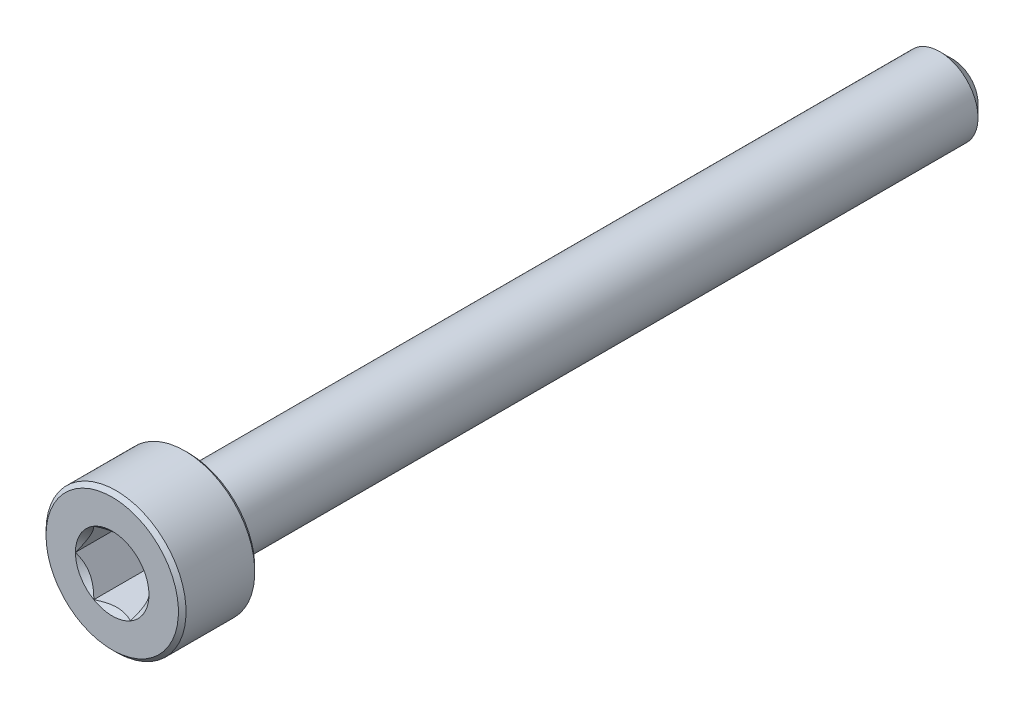
ISO-10303-21;
HEADER;
FILE_DESCRIPTION(('STEP AP214'),'2;1');
FILE_NAME('part.step','',(''),(''),'','','');
FILE_SCHEMA(('AUTOMOTIVE_DESIGN { 1 0 10303 214 1 1 1 1 }'));
ENDSEC;
DATA;
#1=APPLICATION_CONTEXT('core data for automotive mechanical design processes');
#2=APPLICATION_PROTOCOL_DEFINITION('international standard','automotive_design',2000,#1);
#3=PRODUCT_CONTEXT('',#1,'mechanical');
#4=PRODUCT('Part','Part','',(#3));
#5=PRODUCT_RELATED_PRODUCT_CATEGORY('part','',(#4));
#6=PRODUCT_DEFINITION_FORMATION('','',#4);
#7=PRODUCT_DEFINITION_CONTEXT('part definition',#1,'design');
#8=PRODUCT_DEFINITION('design','',#6,#7);
#9=PRODUCT_DEFINITION_SHAPE('','',#8);
#10=(LENGTH_UNIT() NAMED_UNIT(*) SI_UNIT(.MILLI.,.METRE.));
#11=(NAMED_UNIT(*) PLANE_ANGLE_UNIT() SI_UNIT($,.RADIAN.));
#12=(NAMED_UNIT(*) SI_UNIT($,.STERADIAN.) SOLID_ANGLE_UNIT());
#13=UNCERTAINTY_MEASURE_WITH_UNIT(LENGTH_MEASURE(1.E-05),#10,'distance_accuracy_value','');
#14=(GEOMETRIC_REPRESENTATION_CONTEXT(3) GLOBAL_UNCERTAINTY_ASSIGNED_CONTEXT((#13)) GLOBAL_UNIT_ASSIGNED_CONTEXT((#10,
#11,#12)) REPRESENTATION_CONTEXT('',''));
#15=CARTESIAN_POINT('',(0.,0.,0.));
#16=DIRECTION('',(0.,0.,1.));
#17=DIRECTION('',(1.,0.,0.));
#18=AXIS2_PLACEMENT_3D('',#15,#16,#17);
#19=CARTESIAN_POINT('',(0.,0.,16.5));
#20=DIRECTION('',(0.,0.,1.));
#21=DIRECTION('',(1.,0.,0.));
#22=AXIS2_PLACEMENT_3D('',#19,#20,#21);
#23=PLANE('',#22);
#24=CARTESIAN_POINT('',(0.,0.,16.5));
#25=DIRECTION('',(0.,0.,1.));
#26=DIRECTION('',(1.,0.,0.));
#27=AXIS2_PLACEMENT_3D('',#24,#25,#26);
#28=CIRCLE('',#27,1.44337567297407);
#29=CARTESIAN_POINT('',(1.44337567297407,0.,16.5));
#30=VERTEX_POINT('',#29);
#31=CARTESIAN_POINT('',(0.721687836487029,1.25000000000001,16.5));
#32=VERTEX_POINT('',#31);
#33=EDGE_CURVE('E107',#30,#32,#28,.T.);
#34=ORIENTED_EDGE('',*,*,#33,.F.);
#35=CARTESIAN_POINT('',(0.721687836487038,-1.25000000000001,16.5));
#36=VERTEX_POINT('',#35);
#37=EDGE_CURVE('E96',#36,#30,#28,.T.);
#38=ORIENTED_EDGE('',*,*,#37,.F.);
#39=CARTESIAN_POINT('',(-0.72168783648703,-1.25000000000001,16.5));
#40=VERTEX_POINT('',#39);
#41=EDGE_CURVE('E104',#40,#36,#28,.T.);
#42=ORIENTED_EDGE('',*,*,#41,.F.);
#43=CARTESIAN_POINT('',(-1.44337567297407,0.,16.5));
#44=VERTEX_POINT('',#43);
#45=EDGE_CURVE('E255',#44,#40,#28,.T.);
#46=ORIENTED_EDGE('',*,*,#45,.F.);
#47=CARTESIAN_POINT('',(-0.721687836487024,1.25000000000001,16.5));
#48=VERTEX_POINT('',#47);
#49=EDGE_CURVE('E129',#48,#44,#28,.T.);
#50=ORIENTED_EDGE('',*,*,#49,.F.);
#51=EDGE_CURVE('E128',#32,#48,#28,.T.);
#52=ORIENTED_EDGE('',*,*,#51,.F.);
#53=EDGE_LOOP('',(#34,#38,#42,#46,#50,#52));
#54=FACE_BOUND('',#53,.T.);
#55=CARTESIAN_POINT('',(0.,0.,16.5));
#56=DIRECTION('',(0.,0.,-1.));
#57=DIRECTION('',(-1.,0.,0.));
#58=AXIS2_PLACEMENT_3D('',#55,#56,#57);
#59=CIRCLE('',#58,2.6);
#60=CARTESIAN_POINT('',(-2.6,0.,16.5));
#61=VERTEX_POINT('',#60);
#62=EDGE_CURVE('E50',#61,#61,#59,.T.);
#63=ORIENTED_EDGE('',*,*,#62,.F.);
#64=EDGE_LOOP('',(#63));
#65=FACE_BOUND('',#64,.T.);
#66=ADVANCED_FACE('F38',(#54,#65),#23,.T.);
#67=CARTESIAN_POINT('',(0.,0.,16.35));
#68=DIRECTION('',(0.,0.,-1.));
#69=DIRECTION('',(-1.,0.,0.));
#70=AXIS2_PLACEMENT_3D('',#67,#68,#69);
#71=CONICAL_SURFACE('',#70,2.75,0.785398163397455);
#72=ORIENTED_EDGE('',*,*,#62,.T.);
#73=EDGE_LOOP('',(#72));
#74=FACE_BOUND('',#73,.T.);
#75=CARTESIAN_POINT('',(0.,0.,16.35));
#76=DIRECTION('',(0.,0.,-1.));
#77=DIRECTION('',(-1.,0.,0.));
#78=AXIS2_PLACEMENT_3D('',#75,#76,#77);
#79=CIRCLE('',#78,2.75);
#80=CARTESIAN_POINT('',(-2.75,0.,16.35));
#81=VERTEX_POINT('',#80);
#82=EDGE_CURVE('E215',#81,#81,#79,.T.);
#83=ORIENTED_EDGE('',*,*,#82,.F.);
#84=EDGE_LOOP('',(#83));
#85=FACE_BOUND('',#84,.T.);
#86=ADVANCED_FACE('F203',(#74,#85),#71,.T.);
#87=CARTESIAN_POINT('',(0.,0.,-16.5));
#88=DIRECTION('',(0.,0.,-1.));
#89=DIRECTION('',(-1.,0.,0.));
#90=AXIS2_PLACEMENT_3D('',#87,#88,#89);
#91=CYLINDRICAL_SURFACE('',#90,2.75);
#92=ORIENTED_EDGE('',*,*,#82,.T.);
#93=EDGE_LOOP('',(#92));
#94=FACE_BOUND('',#93,.T.);
#95=CARTESIAN_POINT('',(0.,0.,13.65));
#96=DIRECTION('',(0.,0.,-1.));
#97=DIRECTION('',(-1.,0.,0.));
#98=AXIS2_PLACEMENT_3D('',#95,#96,#97);
#99=CIRCLE('',#98,2.75);
#100=CARTESIAN_POINT('',(-2.75,0.,13.65));
#101=VERTEX_POINT('',#100);
#102=EDGE_CURVE('E216',#101,#101,#99,.T.);
#103=ORIENTED_EDGE('',*,*,#102,.F.);
#104=EDGE_LOOP('',(#103));
#105=FACE_BOUND('',#104,.T.);
#106=ADVANCED_FACE('F200',(#94,#105),#91,.T.);
#107=CARTESIAN_POINT('',(0.,0.,13.5));
#108=DIRECTION('',(0.,0.,1.));
#109=DIRECTION('',(1.,0.,0.));
#110=AXIS2_PLACEMENT_3D('',#107,#108,#109);
#111=CONICAL_SURFACE('',#110,2.6,0.785398163397437);
#112=ORIENTED_EDGE('',*,*,#102,.T.);
#113=EDGE_LOOP('',(#112));
#114=FACE_BOUND('',#113,.T.);
#115=CARTESIAN_POINT('',(0.,0.,13.5));
#116=DIRECTION('',(0.,0.,-1.));
#117=DIRECTION('',(-1.,0.,0.));
#118=AXIS2_PLACEMENT_3D('',#115,#116,#117);
#119=CIRCLE('',#118,2.6);
#120=CARTESIAN_POINT('',(-2.6,0.,13.5));
#121=VERTEX_POINT('',#120);
#122=EDGE_CURVE('E219',#121,#121,#119,.T.);
#123=ORIENTED_EDGE('',*,*,#122,.F.);
#124=EDGE_LOOP('',(#123));
#125=FACE_BOUND('',#124,.T.);
#126=ADVANCED_FACE('F196',(#114,#125),#111,.T.);
#127=CARTESIAN_POINT('',(0.,2.6,13.5));
#128=DIRECTION('',(0.,0.,-1.));
#129=DIRECTION('',(-1.,0.,0.));
#130=AXIS2_PLACEMENT_3D('',#127,#128,#129);
#131=PLANE('',#130);
#132=ORIENTED_EDGE('',*,*,#122,.T.);
#133=EDGE_LOOP('',(#132));
#134=FACE_BOUND('',#133,.T.);
#135=CARTESIAN_POINT('',(0.,0.,13.5));
#136=DIRECTION('',(0.,0.,-1.));
#137=DIRECTION('',(-1.,0.,0.));
#138=AXIS2_PLACEMENT_3D('',#135,#136,#137);
#139=CIRCLE('',#138,1.5);
#140=CARTESIAN_POINT('',(-1.5,0.,13.5));
#141=VERTEX_POINT('',#140);
#142=EDGE_CURVE('E224',#141,#141,#139,.T.);
#143=ORIENTED_EDGE('',*,*,#142,.F.);
#144=EDGE_LOOP('',(#143));
#145=FACE_BOUND('',#144,.T.);
#146=ADVANCED_FACE('F192',(#134,#145),#131,.T.);
#147=CARTESIAN_POINT('',(0.,0.,-16.5));
#148=DIRECTION('',(0.,0.,-1.));
#149=DIRECTION('',(-1.,0.,0.));
#150=AXIS2_PLACEMENT_3D('',#147,#148,#149);
#151=CYLINDRICAL_SURFACE('',#150,1.5);
#152=ORIENTED_EDGE('',*,*,#142,.T.);
#153=EDGE_LOOP('',(#152));
#154=FACE_BOUND('',#153,.T.);
#155=CARTESIAN_POINT('',(0.,0.,-16.));
#156=DIRECTION('',(0.,0.,-1.));
#157=DIRECTION('',(-1.,0.,0.));
#158=AXIS2_PLACEMENT_3D('',#155,#156,#157);
#159=CIRCLE('',#158,1.5);
#160=CARTESIAN_POINT('',(-1.5,0.,-16.));
#161=VERTEX_POINT('',#160);
#162=EDGE_CURVE('E402',#161,#161,#159,.T.);
#163=ORIENTED_EDGE('',*,*,#162,.F.);
#164=EDGE_LOOP('',(#163));
#165=FACE_BOUND('',#164,.T.);
#166=ADVANCED_FACE('F189',(#154,#165),#151,.T.);
#167=CARTESIAN_POINT('',(0.,0.,16.5));
#168=DIRECTION('',(0.,0.,1.));
#169=DIRECTION('',(1.,0.,0.));
#170=AXIS2_PLACEMENT_3D('',#167,#168,#169);
#171=CONICAL_SURFACE('',#170,1.44337567297407,0.78539816339745);
#172=ORIENTED_EDGE('',*,*,#33,.T.);
#173=CARTESIAN_POINT('',(1.44349114302791,-0.000200000000010102,16.5001154839091));
#174=CARTESIAN_POINT('',(1.41867941875066,0.0427751670715772,16.4753216680551));
#175=CARTESIAN_POINT('',(1.39345276980744,0.0864690047459395,16.4519837344187));
#176=CARTESIAN_POINT('',(1.34201263554195,0.175565930841935,16.4092520040845));
#177=CARTESIAN_POINT('',(1.31579425481277,0.220977498357058,16.3898819923604));
#178=CARTESIAN_POINT('',(1.26292610442246,0.312547820935255,16.3567004834135));
#179=CARTESIAN_POINT('',(1.23628980770471,0.358683240175882,16.3428055590527));
#180=CARTESIAN_POINT('',(1.18243062538508,0.451970080407591,16.3213972821606));
#181=CARTESIAN_POINT('',(1.15520938653761,0.499118649136379,16.3138679415668));
#182=CARTESIAN_POINT('',(1.10829684367467,0.580373556887253,16.3070744980507));
#183=CARTESIAN_POINT('',(1.08866617256958,0.614374876627941,16.3060685591043));
#184=CARTESIAN_POINT('',(1.04943932800611,0.682317764432478,16.3077614149113));
#185=CARTESIAN_POINT('',(1.02984316311599,0.716259317655658,16.3104610272155));
#186=CARTESIAN_POINT('',(0.990839954603499,0.7838148564575,16.3194089303164));
#187=CARTESIAN_POINT('',(0.971433104248771,0.817428507286776,16.3256605258997));
#188=CARTESIAN_POINT('',(0.932943395609905,0.884094638217814,16.3413756814139));
#189=CARTESIAN_POINT('',(0.9138606800983,0.917146871030296,16.3508406200875));
#190=CARTESIAN_POINT('',(0.864986351354568,1.00179969160027,16.3789313906876));
#191=CARTESIAN_POINT('',(0.835502920149076,1.05286649242964,16.3996701574522));
#192=CARTESIAN_POINT('',(0.777690319475909,1.15300085411326,16.4463871346715));
#193=CARTESIAN_POINT('',(0.749357745598417,1.20207431157827,16.4723482959468));
#194=CARTESIAN_POINT('',(0.721572366433194,1.2502,16.5001154839091));
#195=B_SPLINE_CURVE_WITH_KNOTS('',3,(#173,#174,#175,#176,#177,#178,#179,#180,#181,#182,#183,
#184,#185,#186,#187,#188,#189,#190,#191,#192,#193,#194),.UNSPECIFIED.,.F.,.F.,(4,2,2,2,2,2,2,2,
2,2,4),(0.,0.166533409618308,0.334037607289768,0.498880396489708,0.663307919240287,
0.78096396345884,0.898645970148466,1.01643764860775,1.13427993171551,1.32148652032142,
1.50809158792575),.UNSPECIFIED.);
#196=EDGE_CURVE('E13',#30,#32,#195,.T.);
#197=ORIENTED_EDGE('',*,*,#196,.F.);
#198=EDGE_LOOP('',(#172,#197));
#199=FACE_BOUND('',#198,.T.);
#200=ADVANCED_FACE('F109',(#199),#171,.F.);
#201=ORIENTED_EDGE('',*,*,#37,.T.);
#202=CARTESIAN_POINT('',(0.7215723664332,-1.25020000000001,16.5001154839091));
#203=CARTESIAN_POINT('',(0.74638409071045,-1.20722483292842,16.4753216680551));
#204=CARTESIAN_POINT('',(0.77161073965367,-1.16353099525406,16.4519837344187));
#205=CARTESIAN_POINT('',(0.82305087391916,-1.07443406915807,16.4092520040845));
#206=CARTESIAN_POINT('',(0.849269254648338,-1.02902250164294,16.3898819923604));
#207=CARTESIAN_POINT('',(0.902137405038641,-0.937452179064748,16.3567004834135));
#208=CARTESIAN_POINT('',(0.928773701756392,-0.891316759824122,16.3428055590527));
#209=CARTESIAN_POINT('',(0.982632884076017,-0.798029919592416,16.3213972821606));
#210=CARTESIAN_POINT('',(1.00985412292349,-0.750881350863629,16.3138679415668));
#211=CARTESIAN_POINT('',(1.05676666578643,-0.669626443112756,16.3070744980507));
#212=CARTESIAN_POINT('',(1.07639733689152,-0.635625123372068,16.3060685591044));
#213=CARTESIAN_POINT('',(1.11562418145499,-0.567682235567531,16.3077614149113));
#214=CARTESIAN_POINT('',(1.13522034634511,-0.53374068234435,16.3104610272155));
#215=CARTESIAN_POINT('',(1.1742235548576,-0.466185143542508,16.3194089303164));
#216=CARTESIAN_POINT('',(1.19363040521233,-0.432571492713233,16.3256605258997));
#217=CARTESIAN_POINT('',(1.2321201138512,-0.365905361782194,16.3413756814139));
#218=CARTESIAN_POINT('',(1.2512028293628,-0.332853128969711,16.3508406200875));
#219=CARTESIAN_POINT('',(1.30007715810654,-0.248200308399743,16.3789313906876));
#220=CARTESIAN_POINT('',(1.32956058931203,-0.197133507570369,16.3996701574522));
#221=CARTESIAN_POINT('',(1.38737318998519,-0.0969991458867541,16.4463871346715));
#222=CARTESIAN_POINT('',(1.41570576386268,-0.0479256884217401,16.4723482959468));
#223=CARTESIAN_POINT('',(1.44349114302791,0.000199999999990726,16.5001154839091));
#224=B_SPLINE_CURVE_WITH_KNOTS('',3,(#202,#203,#204,#205,#206,#207,#208,#209,#210,#211,#212,
#213,#214,#215,#216,#217,#218,#219,#220,#221,#222,#223),.UNSPECIFIED.,.F.,.F.,(4,2,2,2,2,2,2,2,
2,2,4),(0.,0.166533409618303,0.334037607289761,0.498880396489696,0.663307919240272,
0.780963963458824,0.898645970148452,1.01643764860773,1.13427993171549,1.32148652032141,
1.50809158792573),.UNSPECIFIED.);
#225=EDGE_CURVE('E99',#36,#30,#224,.T.);
#226=ORIENTED_EDGE('',*,*,#225,.F.);
#227=EDGE_LOOP('',(#201,#226));
#228=FACE_BOUND('',#227,.T.);
#229=ADVANCED_FACE('F98',(#228),#171,.F.);
#230=ORIENTED_EDGE('',*,*,#41,.T.);
#231=CARTESIAN_POINT('',(-1.43934010808077,-1.25000000000001,16.9629820968923));
#232=CARTESIAN_POINT('',(-1.40429313005658,-1.25000000000001,16.9365249226329));
#233=CARTESIAN_POINT('',(-1.36905087135599,-1.25000000000001,16.9103271603543));
#234=CARTESIAN_POINT('',(-1.29809650706311,-1.25000000000001,16.8585575718396));
#235=CARTESIAN_POINT('',(-1.26238428576495,-1.25000000000001,16.8329859043563));
#236=CARTESIAN_POINT('',(-1.15390111792708,-1.25000000000001,16.7570059936895));
#237=CARTESIAN_POINT('',(-1.08031646726264,-1.25000000000001,16.7077402861896));
#238=CARTESIAN_POINT('',(-0.926012322755092,-1.25000000000001,16.6110258302631));
#239=CARTESIAN_POINT('',(-0.845125318656144,-1.25000000000001,16.5638412989418));
#240=CARTESIAN_POINT('',(-0.6793111740766,-1.25000000000001,16.4775307343904));
#241=CARTESIAN_POINT('',(-0.594398891026686,-1.25000000000001,16.4383775346269));
#242=CARTESIAN_POINT('',(-0.466944812460738,-1.25000000000001,16.3904772236883));
#243=CARTESIAN_POINT('',(-0.42628998581282,-1.25000000000001,16.3767294897863));
#244=CARTESIAN_POINT('',(-0.343998850091266,-1.25000000000001,16.3524979274505));
#245=CARTESIAN_POINT('',(-0.302362473614961,-1.25000000000001,16.3420143238698));
#246=CARTESIAN_POINT('',(-0.219052696285664,-1.25000000000001,16.3250301617483));
#247=CARTESIAN_POINT('',(-0.177393428474499,-1.25000000000001,16.3184613604714));
#248=CARTESIAN_POINT('',(-0.093629369340191,-1.25000000000001,16.3094350534578));
#249=CARTESIAN_POINT('',(-0.0515246558543948,-1.25000000000001,16.3069768409973));
#250=CARTESIAN_POINT('',(0.0311890576306331,-1.25000000000001,16.3063540620133));
#251=CARTESIAN_POINT('',(0.071796962549932,-1.25000000000001,16.3080371168463));
#252=CARTESIAN_POINT('',(0.152668636885199,-1.25000000000001,16.3152682705979));
#253=CARTESIAN_POINT('',(0.19293233883536,-1.25000000000001,16.3208171104131));
#254=CARTESIAN_POINT('',(0.273499879165297,-1.25000000000001,16.335571036465));
#255=CARTESIAN_POINT('',(0.313792180618513,-1.25000000000001,16.3448381759641));
#256=CARTESIAN_POINT('',(0.393496413911459,-1.25000000000001,16.3665361784573));
#257=CARTESIAN_POINT('',(0.432908419115061,-1.25000000000001,16.3789667767306));
#258=CARTESIAN_POINT('',(0.5569927358623,-1.25000000000001,16.4227793529314));
#259=CARTESIAN_POINT('',(0.639898924666087,-1.25000000000001,16.459151072876));
#260=CARTESIAN_POINT('',(0.801816555499702,-1.25000000000001,16.5400191621783));
#261=CARTESIAN_POINT('',(0.880812666325045,-1.25000000000001,16.584544720912));
#262=CARTESIAN_POINT('',(1.0317856127975,-1.25000000000001,16.6764048766666));
#263=CARTESIAN_POINT('',(1.10391618485086,-1.25000000000001,16.7234899339163));
#264=CARTESIAN_POINT('',(1.21018606043311,-1.25000000000001,16.7962785615985));
#265=CARTESIAN_POINT('',(1.2451506996938,-1.25000000000001,16.8207980853934));
#266=CARTESIAN_POINT('',(1.31460220852737,-1.25000000000001,16.8704856367657));
#267=CARTESIAN_POINT('',(1.34908920596618,-1.25000000000001,16.8956534854155));
#268=CARTESIAN_POINT('',(1.38337731682912,-1.25000000000001,16.9210901488412));
#269=B_SPLINE_CURVE_WITH_KNOTS('',3,(#231,#232,#233,#234,#235,#236,#237,#238,#239,#240,#241,
#242,#243,#244,#245,#246,#247,#248,#249,#250,#251,#252,#253,#254,#255,#256,#257,#258,#259,#260,
#261,#262,#263,#264,#265,#266,#267,#268),.UNSPECIFIED.,.F.,.F.,(4,2,2,2,2,2,2,2,2,2,2,2,2,2,2,2,
2,2,4),(0.,0.131732960381448,0.263498984161644,0.529042014455826,0.809741926134618,
1.08947609717225,1.21811634272576,1.346765447839,1.47310084517844,1.59941451973784,
1.72115042167849,1.84290966131735,1.96679153905341,2.09066305366039,2.36146692896009,
2.63325989198491,2.89154668212279,3.01965734507713,3.14773302245628),.UNSPECIFIED.);
#270=EDGE_CURVE('E118',#40,#36,#269,.T.);
#271=ORIENTED_EDGE('',*,*,#270,.F.);
#272=EDGE_LOOP('',(#230,#271));
#273=FACE_BOUND('',#272,.T.);
#274=ADVANCED_FACE('F261',(#273),#171,.F.);
#275=ORIENTED_EDGE('',*,*,#45,.T.);
#276=CARTESIAN_POINT('',(-1.4434911430279,0.000199999999998555,16.5001154839091));
#277=CARTESIAN_POINT('',(-1.41867941875065,-0.0427751670715877,16.4753216680551));
#278=CARTESIAN_POINT('',(-1.39345276980743,-0.0864690047459486,16.4519837344187));
#279=CARTESIAN_POINT('',(-1.34201263554194,-0.175565930841942,16.4092520040845));
#280=CARTESIAN_POINT('',(-1.31579425481277,-0.220977498357065,16.3898819923604));
#281=CARTESIAN_POINT('',(-1.26292610442246,-0.312547820935261,16.3567004834135));
#282=CARTESIAN_POINT('',(-1.23628980770471,-0.358683240175887,16.3428055590527));
#283=CARTESIAN_POINT('',(-1.18243062538509,-0.451970080407594,16.3213972821606));
#284=CARTESIAN_POINT('',(-1.15520938653761,-0.499118649136382,16.3138679415668));
#285=CARTESIAN_POINT('',(-1.10829684367467,-0.580373556887255,16.3070744980507));
#286=CARTESIAN_POINT('',(-1.08866617256958,-0.614374876627943,16.3060685591044));
#287=CARTESIAN_POINT('',(-1.04943932800611,-0.68231776443248,16.3077614149113));
#288=CARTESIAN_POINT('',(-1.02984316311599,-0.71625931765566,16.3104610272155));
#289=CARTESIAN_POINT('',(-0.9908399546035,-0.783814856457503,16.3194089303164));
#290=CARTESIAN_POINT('',(-0.971433104248772,-0.817428507286778,16.3256605258997));
#291=CARTESIAN_POINT('',(-0.932943395609906,-0.884094638217816,16.3413756814139));
#292=CARTESIAN_POINT('',(-0.913860680098301,-0.917146871030299,16.3508406200875));
#293=CARTESIAN_POINT('',(-0.864986351354568,-1.00179969160027,16.3789313906876));
#294=CARTESIAN_POINT('',(-0.835502920149076,-1.05286649242964,16.3996701574522));
#295=CARTESIAN_POINT('',(-0.777690319475908,-1.15300085411326,16.4463871346715));
#296=CARTESIAN_POINT('',(-0.749357745598416,-1.20207431157827,16.4723482959468));
#297=CARTESIAN_POINT('',(-0.721572366433193,-1.25020000000001,16.5001154839091));
#298=B_SPLINE_CURVE_WITH_KNOTS('',3,(#276,#277,#278,#279,#280,#281,#282,#283,#284,#285,#286,
#287,#288,#289,#290,#291,#292,#293,#294,#295,#296,#297),.UNSPECIFIED.,.F.,.F.,(4,2,2,2,2,2,2,2,
2,2,4),(0.,0.166533409618302,0.334037607289762,0.498880396489699,0.663307919240276,
0.780963963458829,0.898645970148455,1.01643764860774,1.1342799317155,1.32148652032141,
1.50809158792574),.UNSPECIFIED.);
#299=EDGE_CURVE('E158',#44,#40,#298,.T.);
#300=ORIENTED_EDGE('',*,*,#299,.F.);
#301=EDGE_LOOP('',(#275,#300));
#302=FACE_BOUND('',#301,.T.);
#303=ADVANCED_FACE('F298',(#302),#171,.F.);
#304=ORIENTED_EDGE('',*,*,#49,.T.);
#305=CARTESIAN_POINT('',(-0.721572366433193,1.2502,16.5001154839091));
#306=CARTESIAN_POINT('',(-0.746384090710443,1.20722483292841,16.4753216680551));
#307=CARTESIAN_POINT('',(-0.771610739653663,1.16353099525405,16.4519837344187));
#308=CARTESIAN_POINT('',(-0.823050873919154,1.07443406915806,16.4092520040845));
#309=CARTESIAN_POINT('',(-0.849269254648332,1.02902250164293,16.3898819923604));
#310=CARTESIAN_POINT('',(-0.902137405038635,0.937452179064738,16.3567004834135));
#311=CARTESIAN_POINT('',(-0.928773701756386,0.891316759824112,16.3428055590526));
#312=CARTESIAN_POINT('',(-0.982632884076012,0.798029919592406,16.3213972821606));
#313=CARTESIAN_POINT('',(-1.00985412292348,0.750881350863619,16.3138679415668));
#314=CARTESIAN_POINT('',(-1.05676666578643,0.669626443112746,16.3070744980507));
#315=CARTESIAN_POINT('',(-1.07639733689152,0.635625123372058,16.3060685591043));
#316=CARTESIAN_POINT('',(-1.11562418145499,0.567682235567521,16.3077614149113));
#317=CARTESIAN_POINT('',(-1.1352203463451,0.533740682344341,16.3104610272155));
#318=CARTESIAN_POINT('',(-1.1742235548576,0.466185143542499,16.3194089303164));
#319=CARTESIAN_POINT('',(-1.19363040521233,0.432571492713224,16.3256605258997));
#320=CARTESIAN_POINT('',(-1.23212011385119,0.365905361782186,16.3413756814139));
#321=CARTESIAN_POINT('',(-1.2512028293628,0.332853128969704,16.3508406200875));
#322=CARTESIAN_POINT('',(-1.30007715810653,0.248200308399734,16.3789313906876));
#323=CARTESIAN_POINT('',(-1.32956058931202,0.197133507570361,16.3996701574522));
#324=CARTESIAN_POINT('',(-1.38737318998519,0.0969991458867441,16.4463871346715));
#325=CARTESIAN_POINT('',(-1.41570576386268,0.0479256884217292,16.4723482959468));
#326=CARTESIAN_POINT('',(-1.4434911430279,-0.000200000000002228,16.5001154839091));
#327=B_SPLINE_CURVE_WITH_KNOTS('',3,(#305,#306,#307,#308,#309,#310,#311,#312,#313,#314,#315,
#316,#317,#318,#319,#320,#321,#322,#323,#324,#325,#326),.UNSPECIFIED.,.F.,.F.,(4,2,2,2,2,2,2,2,
2,2,4),(0.,0.166533409618303,0.334037607289763,0.498880396489699,0.663307919240275,
0.780963963458827,0.898645970148453,1.01643764860773,1.1342799317155,1.32148652032141,
1.50809158792574),.UNSPECIFIED.);
#328=EDGE_CURVE('E164',#48,#44,#327,.T.);
#329=ORIENTED_EDGE('',*,*,#328,.F.);
#330=EDGE_LOOP('',(#304,#329));
#331=FACE_BOUND('',#330,.T.);
#332=ADVANCED_FACE('F148',(#331),#171,.F.);
#333=ORIENTED_EDGE('',*,*,#51,.T.);
#334=CARTESIAN_POINT('',(-1.43934010808077,1.25,16.9629820968923));
#335=CARTESIAN_POINT('',(-1.40429313005659,1.25,16.9365249226329));
#336=CARTESIAN_POINT('',(-1.36905087135599,1.25,16.9103271603543));
#337=CARTESIAN_POINT('',(-1.29809650706311,1.25,16.8585575718396));
#338=CARTESIAN_POINT('',(-1.26238428576496,1.25,16.8329859043563));
#339=CARTESIAN_POINT('',(-1.15390111792708,1.25,16.7570059936895));
#340=CARTESIAN_POINT('',(-1.08031646726265,1.25,16.7077402861896));
#341=CARTESIAN_POINT('',(-0.926012322755097,1.25,16.6110258302631));
#342=CARTESIAN_POINT('',(-0.845125318656149,1.25,16.5638412989418));
#343=CARTESIAN_POINT('',(-0.679311174076605,1.25,16.4775307343904));
#344=CARTESIAN_POINT('',(-0.59439889102669,1.25,16.4383775346269));
#345=CARTESIAN_POINT('',(-0.466944812460743,1.25,16.3904772236883));
#346=CARTESIAN_POINT('',(-0.426289985812825,1.25,16.3767294897863));
#347=CARTESIAN_POINT('',(-0.343998850091271,1.25,16.3524979274505));
#348=CARTESIAN_POINT('',(-0.302362473614966,1.25,16.3420143238698));
#349=CARTESIAN_POINT('',(-0.219052696285669,1.25,16.3250301617483));
#350=CARTESIAN_POINT('',(-0.177393428474503,1.25,16.3184613604714));
#351=CARTESIAN_POINT('',(-0.0936293693401954,1.25,16.3094350534578));
#352=CARTESIAN_POINT('',(-0.0515246558543994,1.25,16.3069768409973));
#353=CARTESIAN_POINT('',(0.031189057630628,1.25,16.3063540620133));
#354=CARTESIAN_POINT('',(0.0717969625499269,1.25,16.3080371168462));
#355=CARTESIAN_POINT('',(0.152668636885194,1.25,16.3152682705979));
#356=CARTESIAN_POINT('',(0.192932338835355,1.25,16.3208171104131));
#357=CARTESIAN_POINT('',(0.273499879165291,1.25,16.3355710364649));
#358=CARTESIAN_POINT('',(0.313792180618507,1.25,16.3448381759641));
#359=CARTESIAN_POINT('',(0.393496413911453,1.25,16.3665361784573));
#360=CARTESIAN_POINT('',(0.432908419115055,1.25,16.3789667767306));
#361=CARTESIAN_POINT('',(0.556992735862293,1.25,16.4227793529314));
#362=CARTESIAN_POINT('',(0.639898924666079,1.25,16.459151072876));
#363=CARTESIAN_POINT('',(0.801816555499694,1.25,16.5400191621783));
#364=CARTESIAN_POINT('',(0.880812666325037,1.25,16.584544720912));
#365=CARTESIAN_POINT('',(1.03178561279749,1.25,16.6764048766666));
#366=CARTESIAN_POINT('',(1.10391618485085,1.25,16.7234899339162));
#367=CARTESIAN_POINT('',(1.2101860604331,1.25,16.7962785615985));
#368=CARTESIAN_POINT('',(1.24515069969379,1.25,16.8207980853934));
#369=CARTESIAN_POINT('',(1.31460220852736,1.25,16.8704856367657));
#370=CARTESIAN_POINT('',(1.34908920596617,1.25,16.8956534854155));
#371=CARTESIAN_POINT('',(1.38337731682911,1.25,16.9210901488412));
#372=B_SPLINE_CURVE_WITH_KNOTS('',3,(#334,#335,#336,#337,#338,#339,#340,#341,#342,#343,#344,
#345,#346,#347,#348,#349,#350,#351,#352,#353,#354,#355,#356,#357,#358,#359,#360,#361,#362,#363,
#364,#365,#366,#367,#368,#369,#370,#371),.UNSPECIFIED.,.F.,.F.,(4,2,2,2,2,2,2,2,2,2,2,2,2,2,2,2,
2,2,4),(0.,0.131732960381448,0.263498984161644,0.529042014455823,0.809741926134617,
1.08947609717225,1.21811634272576,1.346765447839,1.47310084517844,1.59941451973784,
1.72115042167849,1.84290966131734,1.96679153905341,2.09066305366039,2.36146692896008,
2.6332598919849,2.89154668212278,3.01965734507712,3.14773302245627),.UNSPECIFIED.);
#373=EDGE_CURVE('E56',#32,#48,#372,.F.);
#374=ORIENTED_EDGE('',*,*,#373,.F.);
#375=EDGE_LOOP('',(#333,#374));
#376=FACE_BOUND('',#375,.T.);
#377=ADVANCED_FACE('F143',(#376),#171,.F.);
#378=CARTESIAN_POINT('',(0.,2.6,14.5));
#379=DIRECTION('',(0.,0.,-1.));
#380=DIRECTION('',(-1.,0.,0.));
#381=AXIS2_PLACEMENT_3D('',#378,#379,#380);
#382=PLANE('',#381);
#383=DIRECTION('',(-0.499999999999999,0.866025403784439,0.));
#384=VECTOR('',#383,1.);
#385=CARTESIAN_POINT('',(1.44337567297407,0.,14.5));
#386=LINE('',#385,#384);
#387=CARTESIAN_POINT('',(1.44337567297407,0.,14.5));
#388=VERTEX_POINT('',#387);
#389=CARTESIAN_POINT('',(0.721687836487033,1.25,14.5));
#390=VERTEX_POINT('',#389);
#391=EDGE_CURVE('E122',#388,#390,#386,.T.);
#392=ORIENTED_EDGE('',*,*,#391,.T.);
#393=DIRECTION('',(-1.,0.,0.));
#394=VECTOR('',#393,1.);
#395=CARTESIAN_POINT('',(0.721687836487033,1.25,14.5));
#396=LINE('',#395,#394);
#397=CARTESIAN_POINT('',(-0.721687836487031,1.25,14.5));
#398=VERTEX_POINT('',#397);
#399=EDGE_CURVE('E233',#390,#398,#396,.T.);
#400=ORIENTED_EDGE('',*,*,#399,.T.);
#401=DIRECTION('',(-0.500000000000001,-0.866025403784438,0.));
#402=VECTOR('',#401,1.);
#403=CARTESIAN_POINT('',(-0.721687836487031,1.25,14.5));
#404=LINE('',#403,#402);
#405=CARTESIAN_POINT('',(-1.44337567297407,0.,14.5));
#406=VERTEX_POINT('',#405);
#407=EDGE_CURVE('E232',#398,#406,#404,.T.);
#408=ORIENTED_EDGE('',*,*,#407,.T.);
#409=DIRECTION('',(0.5,-0.866025403784439,0.));
#410=VECTOR('',#409,1.);
#411=CARTESIAN_POINT('',(-1.44337567297407,0.,14.5));
#412=LINE('',#411,#410);
#413=CARTESIAN_POINT('',(-0.721687836487031,-1.25000000000001,14.5));
#414=VERTEX_POINT('',#413);
#415=EDGE_CURVE('E237',#406,#414,#412,.T.);
#416=ORIENTED_EDGE('',*,*,#415,.T.);
#417=DIRECTION('',(1.,0.,0.));
#418=VECTOR('',#417,1.);
#419=CARTESIAN_POINT('',(-0.721687836487031,-1.25000000000001,14.5));
#420=LINE('',#419,#418);
#421=CARTESIAN_POINT('',(0.721687836487038,-1.25000000000001,14.5));
#422=VERTEX_POINT('',#421);
#423=EDGE_CURVE('E241',#414,#422,#420,.T.);
#424=ORIENTED_EDGE('',*,*,#423,.T.);
#425=DIRECTION('',(0.5,0.866025403784438,0.));
#426=VECTOR('',#425,1.);
#427=CARTESIAN_POINT('',(0.721687836487038,-1.25000000000001,14.5));
#428=LINE('',#427,#426);
#429=EDGE_CURVE('E123',#422,#388,#428,.T.);
#430=ORIENTED_EDGE('',*,*,#429,.T.);
#431=EDGE_LOOP('',(#392,#400,#408,#416,#424,#430));
#432=FACE_BOUND('',#431,.T.);
#433=ADVANCED_FACE('F147',(#432),#382,.F.);
#434=CARTESIAN_POINT('',(1.44337567297407,0.,9.68118692087012));
#435=DIRECTION('',(0.866025403784439,0.499999999999999,0.));
#436=DIRECTION('',(-0.499999999999999,0.866025403784439,0.));
#437=AXIS2_PLACEMENT_3D('',#434,#435,#436);
#438=PLANE('',#437);
#439=DIRECTION('',(0.,0.,1.));
#440=VECTOR('',#439,1.);
#441=CARTESIAN_POINT('',(1.44337567297407,0.,9.68118692087012));
#442=LINE('',#441,#440);
#443=EDGE_CURVE('E116',#388,#30,#442,.T.);
#444=ORIENTED_EDGE('',*,*,#443,.T.);
#445=ORIENTED_EDGE('',*,*,#196,.T.);
#446=DIRECTION('',(0.,0.,1.));
#447=VECTOR('',#446,1.);
#448=CARTESIAN_POINT('',(0.721687836487033,1.25,9.68118692087012));
#449=LINE('',#448,#447);
#450=EDGE_CURVE('E227',#390,#32,#449,.T.);
#451=ORIENTED_EDGE('',*,*,#450,.F.);
#452=ORIENTED_EDGE('',*,*,#391,.F.);
#453=EDGE_LOOP('',(#444,#445,#451,#452));
#454=FACE_BOUND('',#453,.T.);
#455=ADVANCED_FACE('F120',(#454),#438,.F.);
#456=CARTESIAN_POINT('',(0.721687836487038,-1.25000000000001,9.68118692087012));
#457=DIRECTION('',(0.866025403784438,-0.5,0.));
#458=DIRECTION('',(0.5,0.866025403784438,0.));
#459=AXIS2_PLACEMENT_3D('',#456,#457,#458);
#460=PLANE('',#459);
#461=DIRECTION('',(0.,0.,1.));
#462=VECTOR('',#461,1.);
#463=CARTESIAN_POINT('',(0.721687836487038,-1.25000000000001,9.68118692087012));
#464=LINE('',#463,#462);
#465=EDGE_CURVE('E64',#422,#36,#464,.T.);
#466=ORIENTED_EDGE('',*,*,#465,.T.);
#467=ORIENTED_EDGE('',*,*,#225,.T.);
#468=ORIENTED_EDGE('',*,*,#443,.F.);
#469=ORIENTED_EDGE('',*,*,#429,.F.);
#470=EDGE_LOOP('',(#466,#467,#468,#469));
#471=FACE_BOUND('',#470,.T.);
#472=ADVANCED_FACE('F115',(#471),#460,.F.);
#473=CARTESIAN_POINT('',(-0.721687836487031,-1.25000000000001,9.68118692087012));
#474=DIRECTION('',(0.,-1.,0.));
#475=DIRECTION('',(0.,0.,-1.));
#476=AXIS2_PLACEMENT_3D('',#473,#474,#475);
#477=PLANE('',#476);
#478=DIRECTION('',(0.,0.,1.));
#479=VECTOR('',#478,1.);
#480=CARTESIAN_POINT('',(-0.721687836487031,-1.25000000000001,9.68118692087012));
#481=LINE('',#480,#479);
#482=EDGE_CURVE('E238',#414,#40,#481,.T.);
#483=ORIENTED_EDGE('',*,*,#482,.T.);
#484=ORIENTED_EDGE('',*,*,#270,.T.);
#485=ORIENTED_EDGE('',*,*,#465,.F.);
#486=ORIENTED_EDGE('',*,*,#423,.F.);
#487=EDGE_LOOP('',(#483,#484,#485,#486));
#488=FACE_BOUND('',#487,.T.);
#489=ADVANCED_FACE('F266',(#488),#477,.F.);
#490=CARTESIAN_POINT('',(-1.44337567297407,0.,9.68118692087012));
#491=DIRECTION('',(-0.866025403784439,-0.5,0.));
#492=DIRECTION('',(0.5,-0.866025403784439,0.));
#493=AXIS2_PLACEMENT_3D('',#490,#491,#492);
#494=PLANE('',#493);
#495=DIRECTION('',(0.,0.,1.));
#496=VECTOR('',#495,1.);
#497=CARTESIAN_POINT('',(-1.44337567297407,0.,9.68118692087012));
#498=LINE('',#497,#496);
#499=EDGE_CURVE('E234',#406,#44,#498,.T.);
#500=ORIENTED_EDGE('',*,*,#499,.T.);
#501=ORIENTED_EDGE('',*,*,#299,.T.);
#502=ORIENTED_EDGE('',*,*,#482,.F.);
#503=ORIENTED_EDGE('',*,*,#415,.F.);
#504=EDGE_LOOP('',(#500,#501,#502,#503));
#505=FACE_BOUND('',#504,.T.);
#506=ADVANCED_FACE('F179',(#505),#494,.F.);
#507=CARTESIAN_POINT('',(-0.721687836487031,1.25,9.68118692087012));
#508=DIRECTION('',(-0.866025403784438,0.500000000000001,0.));
#509=DIRECTION('',(-0.500000000000001,-0.866025403784438,0.));
#510=AXIS2_PLACEMENT_3D('',#507,#508,#509);
#511=PLANE('',#510);
#512=DIRECTION('',(0.,0.,1.));
#513=VECTOR('',#512,1.);
#514=CARTESIAN_POINT('',(-0.721687836487031,1.25,9.68118692087012));
#515=LINE('',#514,#513);
#516=EDGE_CURVE('E229',#398,#48,#515,.T.);
#517=ORIENTED_EDGE('',*,*,#516,.T.);
#518=ORIENTED_EDGE('',*,*,#328,.T.);
#519=ORIENTED_EDGE('',*,*,#499,.F.);
#520=ORIENTED_EDGE('',*,*,#407,.F.);
#521=EDGE_LOOP('',(#517,#518,#519,#520));
#522=FACE_BOUND('',#521,.T.);
#523=ADVANCED_FACE('F175',(#522),#511,.F.);
#524=CARTESIAN_POINT('',(0.721687836487033,1.25,9.68118692087012));
#525=DIRECTION('',(0.,1.,0.));
#526=DIRECTION('',(-1.,0.,0.));
#527=AXIS2_PLACEMENT_3D('',#524,#525,#526);
#528=PLANE('',#527);
#529=ORIENTED_EDGE('',*,*,#450,.T.);
#530=ORIENTED_EDGE('',*,*,#373,.T.);
#531=ORIENTED_EDGE('',*,*,#516,.F.);
#532=ORIENTED_EDGE('',*,*,#399,.F.);
#533=EDGE_LOOP('',(#529,#530,#531,#532));
#534=FACE_BOUND('',#533,.T.);
#535=ADVANCED_FACE('F178',(#534),#528,.F.);
#536=CARTESIAN_POINT('',(0.,1.,-16.5));
#537=DIRECTION('',(0.,0.,-1.));
#538=DIRECTION('',(-1.,0.,0.));
#539=AXIS2_PLACEMENT_3D('',#536,#537,#538);
#540=PLANE('',#539);
#541=CARTESIAN_POINT('',(0.,0.,-16.5));
#542=DIRECTION('',(0.,0.,-1.));
#543=DIRECTION('',(-1.,0.,0.));
#544=AXIS2_PLACEMENT_3D('',#541,#542,#543);
#545=CIRCLE('',#544,1.);
#546=CARTESIAN_POINT('',(-1.,0.,-16.5));
#547=VERTEX_POINT('',#546);
#548=EDGE_CURVE('E105',#547,#547,#545,.T.);
#549=ORIENTED_EDGE('',*,*,#548,.T.);
#550=EDGE_LOOP('',(#549));
#551=FACE_BOUND('',#550,.T.);
#552=ADVANCED_FACE('F149',(#551),#540,.T.);
#553=CARTESIAN_POINT('',(0.,0.,-16.5));
#554=DIRECTION('',(0.,0.,1.));
#555=DIRECTION('',(1.,0.,0.));
#556=AXIS2_PLACEMENT_3D('',#553,#554,#555);
#557=CONICAL_SURFACE('',#556,1.,0.785398163397441);
#558=ORIENTED_EDGE('',*,*,#162,.T.);
#559=EDGE_LOOP('',(#558));
#560=FACE_BOUND('',#559,.T.);
#561=ORIENTED_EDGE('',*,*,#548,.F.);
#562=EDGE_LOOP('',(#561));
#563=FACE_BOUND('',#562,.T.);
#564=ADVANCED_FACE('F387',(#560,#563),#557,.T.);
#565=CLOSED_SHELL('',(#66,#86,#106,#126,#146,#166,#200,#229,#274,#303,#332,#377,#433,#455,#472,
#489,#506,#523,#535,#552,#564));
#566=MANIFOLD_SOLID_BREP('B2',#565);
#567=ADVANCED_BREP_SHAPE_REPRESENTATION('',(#18,#566),#14);
#568=SHAPE_DEFINITION_REPRESENTATION(#9,#567);
ENDSEC;
END-ISO-10303-21;
